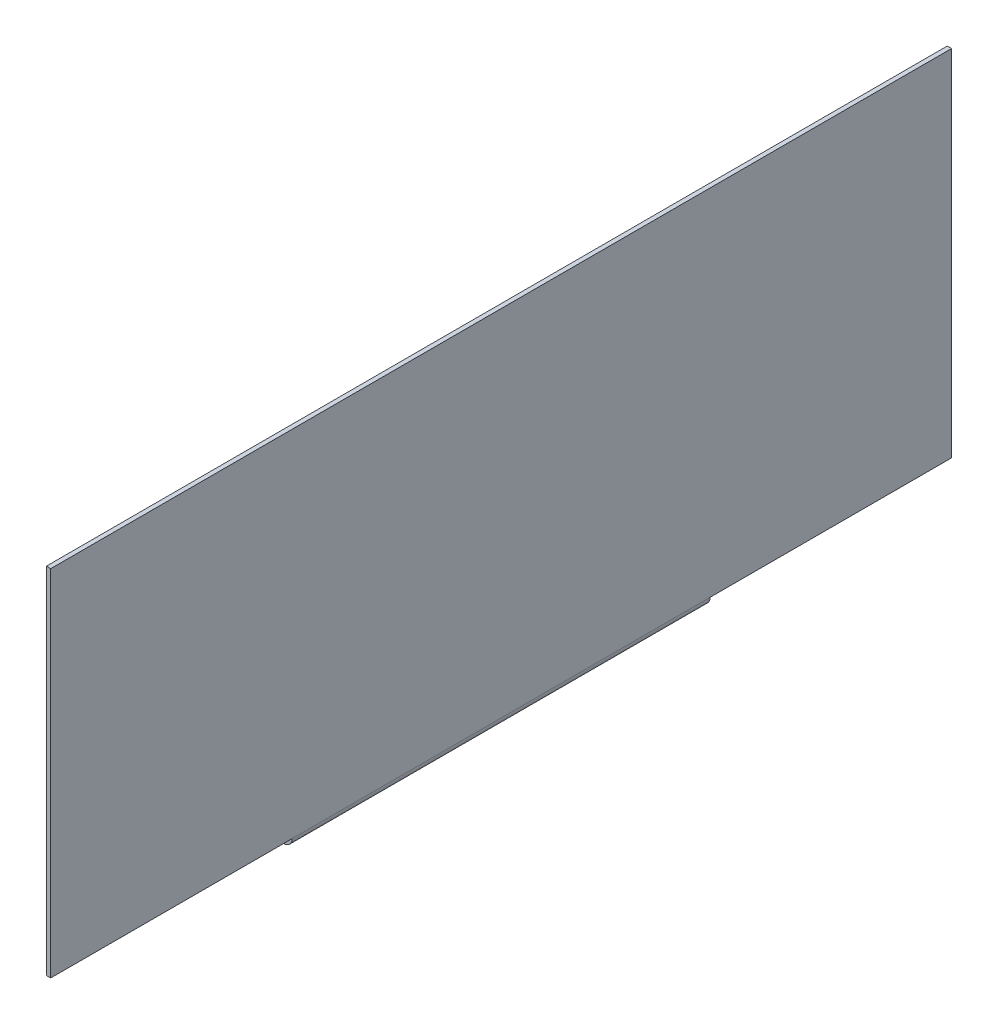
ISO-10303-21;
HEADER;
FILE_DESCRIPTION(('STEP AP214'),'2;1');
FILE_NAME('part.step','',(''),(''),'','','');
FILE_SCHEMA(('AUTOMOTIVE_DESIGN { 1 0 10303 214 1 1 1 1 }'));
ENDSEC;
DATA;
#1=APPLICATION_CONTEXT('core data for automotive mechanical design processes');
#2=APPLICATION_PROTOCOL_DEFINITION('international standard','automotive_design',2000,#1);
#3=PRODUCT_CONTEXT('',#1,'mechanical');
#4=PRODUCT('Part','Part','',(#3));
#5=PRODUCT_RELATED_PRODUCT_CATEGORY('part','',(#4));
#6=PRODUCT_DEFINITION_FORMATION('','',#4);
#7=PRODUCT_DEFINITION_CONTEXT('part definition',#1,'design');
#8=PRODUCT_DEFINITION('design','',#6,#7);
#9=PRODUCT_DEFINITION_SHAPE('','',#8);
#10=(LENGTH_UNIT() NAMED_UNIT(*) SI_UNIT(.MILLI.,.METRE.));
#11=(NAMED_UNIT(*) PLANE_ANGLE_UNIT() SI_UNIT($,.RADIAN.));
#12=(NAMED_UNIT(*) SI_UNIT($,.STERADIAN.) SOLID_ANGLE_UNIT());
#13=UNCERTAINTY_MEASURE_WITH_UNIT(LENGTH_MEASURE(1.E-05),#10,'distance_accuracy_value','');
#14=(GEOMETRIC_REPRESENTATION_CONTEXT(3) GLOBAL_UNCERTAINTY_ASSIGNED_CONTEXT((#13)) GLOBAL_UNIT_ASSIGNED_CONTEXT((#10,
#11,#12)) REPRESENTATION_CONTEXT('',''));
#15=CARTESIAN_POINT('',(0.,0.,0.));
#16=DIRECTION('',(0.,0.,1.));
#17=DIRECTION('',(1.,0.,0.));
#18=AXIS2_PLACEMENT_3D('',#15,#16,#17);
#19=CARTESIAN_POINT('',(-3.175,-130.175,330.79309));
#20=DIRECTION('',(0.,-1.,0.));
#21=DIRECTION('',(0.,0.,-1.));
#22=AXIS2_PLACEMENT_3D('',#19,#20,#21);
#23=PLANE('',#22);
#24=DIRECTION('',(0.,0.,-1.));
#25=VECTOR('',#24,1.);
#26=CARTESIAN_POINT('',(-3.175,-130.175,330.79309));
#27=LINE('',#26,#25);
#28=CARTESIAN_POINT('',(-3.175,-130.175,330.79309));
#29=VERTEX_POINT('',#28);
#30=CARTESIAN_POINT('',(-3.175,-130.175,153.43886));
#31=VERTEX_POINT('',#30);
#32=EDGE_CURVE('E215',#29,#31,#27,.T.);
#33=ORIENTED_EDGE('',*,*,#32,.T.);
#34=DIRECTION('',(1.,0.,0.));
#35=VECTOR('',#34,1.);
#36=CARTESIAN_POINT('',(-3.175,-130.175,153.43886));
#37=LINE('',#36,#35);
#38=CARTESIAN_POINT('',(0.,-130.175,153.43886));
#39=VERTEX_POINT('',#38);
#40=EDGE_CURVE('E195',#31,#39,#37,.T.);
#41=ORIENTED_EDGE('',*,*,#40,.T.);
#42=DIRECTION('',(0.,0.,-1.));
#43=VECTOR('',#42,1.);
#44=CARTESIAN_POINT('',(0.,-130.175,330.79309));
#45=LINE('',#44,#43);
#46=CARTESIAN_POINT('',(0.,-130.175,330.79309));
#47=VERTEX_POINT('',#46);
#48=EDGE_CURVE('E210',#47,#39,#45,.T.);
#49=ORIENTED_EDGE('',*,*,#48,.F.);
#50=DIRECTION('',(1.,0.,0.));
#51=VECTOR('',#50,1.);
#52=CARTESIAN_POINT('',(-3.175,-130.175,330.79309));
#53=LINE('',#52,#51);
#54=EDGE_CURVE('E67',#29,#47,#53,.T.);
#55=ORIENTED_EDGE('',*,*,#54,.F.);
#56=EDGE_LOOP('',(#33,#41,#49,#55));
#57=FACE_BOUND('',#56,.T.);
#58=ADVANCED_FACE('F58',(#57),#23,.T.);
#59=CARTESIAN_POINT('',(-3.175,130.175,-330.79309));
#60=DIRECTION('',(0.,0.,-1.));
#61=DIRECTION('',(-1.,0.,0.));
#62=AXIS2_PLACEMENT_3D('',#59,#60,#61);
#63=PLANE('',#62);
#64=DIRECTION('',(0.,1.,0.));
#65=VECTOR('',#64,1.);
#66=CARTESIAN_POINT('',(0.,130.175,-330.79309));
#67=LINE('',#66,#65);
#68=CARTESIAN_POINT('',(0.,-130.175,-330.79309));
#69=VERTEX_POINT('',#68);
#70=CARTESIAN_POINT('',(0.,130.175,-330.79309));
#71=VERTEX_POINT('',#70);
#72=EDGE_CURVE('E204',#69,#71,#67,.T.);
#73=ORIENTED_EDGE('',*,*,#72,.F.);
#74=DIRECTION('',(1.,0.,0.));
#75=VECTOR('',#74,1.);
#76=CARTESIAN_POINT('',(-3.175,-130.175,-330.79309));
#77=LINE('',#76,#75);
#78=CARTESIAN_POINT('',(-3.175,-130.175,-330.79309));
#79=VERTEX_POINT('',#78);
#80=EDGE_CURVE('E13',#79,#69,#77,.T.);
#81=ORIENTED_EDGE('',*,*,#80,.F.);
#82=DIRECTION('',(0.,1.,0.));
#83=VECTOR('',#82,1.);
#84=CARTESIAN_POINT('',(-3.175,130.175,-330.79309));
#85=LINE('',#84,#83);
#86=CARTESIAN_POINT('',(-3.175,130.175,-330.79309));
#87=VERTEX_POINT('',#86);
#88=EDGE_CURVE('E206',#79,#87,#85,.T.);
#89=ORIENTED_EDGE('',*,*,#88,.T.);
#90=DIRECTION('',(1.,0.,0.));
#91=VECTOR('',#90,1.);
#92=CARTESIAN_POINT('',(-3.175,130.175,-330.79309));
#93=LINE('',#92,#91);
#94=EDGE_CURVE('E62',#87,#71,#93,.T.);
#95=ORIENTED_EDGE('',*,*,#94,.T.);
#96=EDGE_LOOP('',(#73,#81,#89,#95));
#97=FACE_BOUND('',#96,.T.);
#98=ADVANCED_FACE('F60',(#97),#63,.T.);
#99=DIRECTION('',(1.,0.,0.));
#100=VECTOR('',#99,1.);
#101=CARTESIAN_POINT('',(-3.175,-130.175,-153.43886));
#102=LINE('',#101,#100);
#103=CARTESIAN_POINT('',(-3.175,-130.175,-153.43886));
#104=VERTEX_POINT('',#103);
#105=CARTESIAN_POINT('',(0.,-130.175,-153.43886));
#106=VERTEX_POINT('',#105);
#107=EDGE_CURVE('E202',#104,#106,#102,.T.);
#108=ORIENTED_EDGE('',*,*,#107,.F.);
#109=EDGE_CURVE('E83',#104,#79,#27,.T.);
#110=ORIENTED_EDGE('',*,*,#109,.T.);
#111=ORIENTED_EDGE('',*,*,#80,.T.);
#112=EDGE_CURVE('E106',#106,#69,#45,.T.);
#113=ORIENTED_EDGE('',*,*,#112,.F.);
#114=EDGE_LOOP('',(#108,#110,#111,#113));
#115=FACE_BOUND('',#114,.T.);
#116=ADVANCED_FACE('F249',(#115),#23,.T.);
#117=CARTESIAN_POINT('',(-3.175,130.175,330.79309));
#118=DIRECTION('',(0.,0.,1.));
#119=DIRECTION('',(1.,0.,0.));
#120=AXIS2_PLACEMENT_3D('',#117,#118,#119);
#121=PLANE('',#120);
#122=DIRECTION('',(0.,-1.,0.));
#123=VECTOR('',#122,1.);
#124=CARTESIAN_POINT('',(0.,130.175,330.79309));
#125=LINE('',#124,#123);
#126=CARTESIAN_POINT('',(0.,130.175,330.79309));
#127=VERTEX_POINT('',#126);
#128=EDGE_CURVE('E222',#127,#47,#125,.T.);
#129=ORIENTED_EDGE('',*,*,#128,.F.);
#130=DIRECTION('',(1.,0.,0.));
#131=VECTOR('',#130,1.);
#132=CARTESIAN_POINT('',(-3.175,130.175,330.79309));
#133=LINE('',#132,#131);
#134=CARTESIAN_POINT('',(-3.175,130.175,330.79309));
#135=VERTEX_POINT('',#134);
#136=EDGE_CURVE('E227',#135,#127,#133,.T.);
#137=ORIENTED_EDGE('',*,*,#136,.F.);
#138=DIRECTION('',(0.,-1.,0.));
#139=VECTOR('',#138,1.);
#140=CARTESIAN_POINT('',(-3.175,130.175,330.79309));
#141=LINE('',#140,#139);
#142=EDGE_CURVE('E212',#135,#29,#141,.T.);
#143=ORIENTED_EDGE('',*,*,#142,.T.);
#144=ORIENTED_EDGE('',*,*,#54,.T.);
#145=EDGE_LOOP('',(#129,#137,#143,#144));
#146=FACE_BOUND('',#145,.T.);
#147=ADVANCED_FACE('F255',(#146),#121,.T.);
#148=CARTESIAN_POINT('',(-3.175,130.175,330.79309));
#149=DIRECTION('',(0.,1.,0.));
#150=DIRECTION('',(0.,0.,1.));
#151=AXIS2_PLACEMENT_3D('',#148,#149,#150);
#152=PLANE('',#151);
#153=DIRECTION('',(0.,0.,1.));
#154=VECTOR('',#153,1.);
#155=CARTESIAN_POINT('',(0.,130.175,330.79309));
#156=LINE('',#155,#154);
#157=EDGE_CURVE('E219',#71,#127,#156,.T.);
#158=ORIENTED_EDGE('',*,*,#157,.F.);
#159=ORIENTED_EDGE('',*,*,#94,.F.);
#160=DIRECTION('',(0.,0.,1.));
#161=VECTOR('',#160,1.);
#162=CARTESIAN_POINT('',(-3.175,130.175,330.79309));
#163=LINE('',#162,#161);
#164=EDGE_CURVE('E209',#87,#135,#163,.T.);
#165=ORIENTED_EDGE('',*,*,#164,.T.);
#166=ORIENTED_EDGE('',*,*,#136,.T.);
#167=EDGE_LOOP('',(#158,#159,#165,#166));
#168=FACE_BOUND('',#167,.T.);
#169=ADVANCED_FACE('F232',(#168),#152,.T.);
#170=CARTESIAN_POINT('',(-3.175,0.,0.));
#171=DIRECTION('',(1.,0.,0.));
#172=DIRECTION('',(0.,0.,-1.));
#173=AXIS2_PLACEMENT_3D('',#170,#171,#172);
#174=PLANE('',#173);
#175=ORIENTED_EDGE('',*,*,#88,.F.);
#176=ORIENTED_EDGE('',*,*,#109,.F.);
#177=DIRECTION('',(0.,0.,1.));
#178=VECTOR('',#177,1.);
#179=CARTESIAN_POINT('',(-3.175,-130.175,153.43886));
#180=LINE('',#179,#178);
#181=EDGE_CURVE('E199',#31,#104,#180,.F.);
#182=ORIENTED_EDGE('',*,*,#181,.F.);
#183=ORIENTED_EDGE('',*,*,#32,.F.);
#184=ORIENTED_EDGE('',*,*,#142,.F.);
#185=ORIENTED_EDGE('',*,*,#164,.F.);
#186=EDGE_LOOP('',(#175,#176,#182,#183,#184,#185));
#187=FACE_BOUND('',#186,.T.);
#188=ADVANCED_FACE('F236',(#187),#174,.F.);
#189=CARTESIAN_POINT('',(0.,0.,0.));
#190=DIRECTION('',(1.,0.,0.));
#191=DIRECTION('',(0.,0.,-1.));
#192=AXIS2_PLACEMENT_3D('',#189,#190,#191);
#193=PLANE('',#192);
#194=ORIENTED_EDGE('',*,*,#72,.T.);
#195=ORIENTED_EDGE('',*,*,#157,.T.);
#196=ORIENTED_EDGE('',*,*,#128,.T.);
#197=ORIENTED_EDGE('',*,*,#48,.T.);
#198=DIRECTION('',(0.,0.,1.));
#199=VECTOR('',#198,1.);
#200=CARTESIAN_POINT('',(0.,-130.175,153.43886));
#201=LINE('',#200,#199);
#202=EDGE_CURVE('E150',#39,#106,#201,.F.);
#203=ORIENTED_EDGE('',*,*,#202,.T.);
#204=ORIENTED_EDGE('',*,*,#112,.T.);
#205=EDGE_LOOP('',(#194,#195,#196,#197,#203,#204));
#206=FACE_BOUND('',#205,.T.);
#207=ADVANCED_FACE('F233',(#206),#193,.T.);
#208=CARTESIAN_POINT('',(-6.35000000000001,-130.175,-153.43886));
#209=DIRECTION('',(0.,0.,-1.));
#210=DIRECTION('',(-1.,0.,0.));
#211=AXIS2_PLACEMENT_3D('',#208,#209,#210);
#212=PLANE('',#211);
#213=DIRECTION('',(0.,-1.,0.));
#214=VECTOR('',#213,1.);
#215=CARTESIAN_POINT('',(-6.34999999999998,-136.525,-153.43886));
#216=LINE('',#215,#214);
#217=CARTESIAN_POINT('',(-6.34999999999999,-133.35,-153.43886));
#218=VERTEX_POINT('',#217);
#219=CARTESIAN_POINT('',(-6.34999999999998,-136.525,-153.43886));
#220=VERTEX_POINT('',#219);
#221=EDGE_CURVE('E190',#218,#220,#216,.T.);
#222=ORIENTED_EDGE('',*,*,#221,.F.);
#223=CARTESIAN_POINT('',(-6.35000000000001,-130.175,-153.43886));
#224=DIRECTION('',(0.,0.,1.));
#225=DIRECTION('',(1.,0.,0.));
#226=AXIS2_PLACEMENT_3D('',#223,#224,#225);
#227=CIRCLE('',#226,3.17500000000001);
#228=EDGE_CURVE('E152',#104,#218,#227,.F.);
#229=ORIENTED_EDGE('',*,*,#228,.F.);
#230=ORIENTED_EDGE('',*,*,#107,.T.);
#231=CARTESIAN_POINT('',(-6.35000000000001,-130.175,-153.43886));
#232=DIRECTION('',(0.,0.,1.));
#233=DIRECTION('',(1.,0.,0.));
#234=AXIS2_PLACEMENT_3D('',#231,#232,#233);
#235=CIRCLE('',#234,6.35000000000001);
#236=EDGE_CURVE('E194',#106,#220,#235,.F.);
#237=ORIENTED_EDGE('',*,*,#236,.T.);
#238=EDGE_LOOP('',(#222,#229,#230,#237));
#239=FACE_BOUND('',#238,.T.);
#240=ADVANCED_FACE('F235',(#239),#212,.T.);
#241=CARTESIAN_POINT('',(-6.35000000000001,-130.175,153.43886));
#242=DIRECTION('',(0.,0.,-1.));
#243=DIRECTION('',(-1.,0.,0.));
#244=AXIS2_PLACEMENT_3D('',#241,#242,#243);
#245=PLANE('',#244);
#246=CARTESIAN_POINT('',(-6.35000000000001,-130.175,153.43886));
#247=DIRECTION('',(0.,0.,1.));
#248=DIRECTION('',(1.,0.,0.));
#249=AXIS2_PLACEMENT_3D('',#246,#247,#248);
#250=CIRCLE('',#249,3.17500000000001);
#251=CARTESIAN_POINT('',(-6.34999999999999,-133.35,153.43886));
#252=VERTEX_POINT('',#251);
#253=EDGE_CURVE('E159',#252,#31,#250,.T.);
#254=ORIENTED_EDGE('',*,*,#253,.F.);
#255=DIRECTION('',(0.,-1.,0.));
#256=VECTOR('',#255,1.);
#257=CARTESIAN_POINT('',(-6.34999999999999,-133.35,153.43886));
#258=LINE('',#257,#256);
#259=CARTESIAN_POINT('',(-6.34999999999998,-136.525,153.43886));
#260=VERTEX_POINT('',#259);
#261=EDGE_CURVE('E156',#252,#260,#258,.T.);
#262=ORIENTED_EDGE('',*,*,#261,.T.);
#263=CARTESIAN_POINT('',(-6.35000000000001,-130.175,153.43886));
#264=DIRECTION('',(0.,0.,1.));
#265=DIRECTION('',(1.,0.,0.));
#266=AXIS2_PLACEMENT_3D('',#263,#264,#265);
#267=CIRCLE('',#266,6.35000000000001);
#268=EDGE_CURVE('E75',#260,#39,#267,.T.);
#269=ORIENTED_EDGE('',*,*,#268,.T.);
#270=ORIENTED_EDGE('',*,*,#40,.F.);
#271=EDGE_LOOP('',(#254,#262,#269,#270));
#272=FACE_BOUND('',#271,.T.);
#273=ADVANCED_FACE('F157',(#272),#245,.F.);
#274=CARTESIAN_POINT('',(-6.35000000000001,-130.175,153.43886));
#275=DIRECTION('',(0.,0.,1.));
#276=DIRECTION('',(0.,-1.,0.));
#277=AXIS2_PLACEMENT_3D('',#274,#275,#276);
#278=CYLINDRICAL_SURFACE('',#277,6.35000000000001);
#279=ORIENTED_EDGE('',*,*,#202,.F.);
#280=ORIENTED_EDGE('',*,*,#268,.F.);
#281=DIRECTION('',(0.,0.,1.));
#282=VECTOR('',#281,1.);
#283=CARTESIAN_POINT('',(-6.34999999999998,-136.525,0.));
#284=LINE('',#283,#282);
#285=EDGE_CURVE('E148',#220,#260,#284,.T.);
#286=ORIENTED_EDGE('',*,*,#285,.F.);
#287=ORIENTED_EDGE('',*,*,#236,.F.);
#288=EDGE_LOOP('',(#279,#280,#286,#287));
#289=FACE_BOUND('',#288,.T.);
#290=ADVANCED_FACE('F145',(#289),#278,.T.);
#291=CARTESIAN_POINT('',(-6.35000000000001,-130.175,153.43886));
#292=DIRECTION('',(0.,0.,1.));
#293=DIRECTION('',(0.,-1.,0.));
#294=AXIS2_PLACEMENT_3D('',#291,#292,#293);
#295=CYLINDRICAL_SURFACE('',#294,3.17500000000001);
#296=ORIENTED_EDGE('',*,*,#181,.T.);
#297=ORIENTED_EDGE('',*,*,#228,.T.);
#298=DIRECTION('',(0.,0.,-1.));
#299=VECTOR('',#298,1.);
#300=CARTESIAN_POINT('',(-6.34999999999999,-133.35,-153.43886));
#301=LINE('',#300,#299);
#302=EDGE_CURVE('E164',#218,#252,#301,.F.);
#303=ORIENTED_EDGE('',*,*,#302,.T.);
#304=ORIENTED_EDGE('',*,*,#253,.T.);
#305=EDGE_LOOP('',(#296,#297,#303,#304));
#306=FACE_BOUND('',#305,.T.);
#307=ADVANCED_FACE('F266',(#306),#295,.F.);
#308=CARTESIAN_POINT('',(-25.4,-136.525,153.43886));
#309=DIRECTION('',(0.,0.,1.));
#310=DIRECTION('',(1.,0.,0.));
#311=AXIS2_PLACEMENT_3D('',#308,#309,#310);
#312=PLANE('',#311);
#313=DIRECTION('',(1.,0.,0.));
#314=VECTOR('',#313,1.);
#315=CARTESIAN_POINT('',(-25.4,-136.525,153.43886));
#316=LINE('',#315,#314);
#317=CARTESIAN_POINT('',(-25.4,-136.525,153.43886));
#318=VERTEX_POINT('',#317);
#319=EDGE_CURVE('E171',#318,#260,#316,.T.);
#320=ORIENTED_EDGE('',*,*,#319,.T.);
#321=ORIENTED_EDGE('',*,*,#261,.F.);
#322=DIRECTION('',(-1.,0.,0.));
#323=VECTOR('',#322,1.);
#324=CARTESIAN_POINT('',(2.9608379240439E-13,-133.35,153.43886));
#325=LINE('',#324,#323);
#326=CARTESIAN_POINT('',(-25.4,-133.35,153.43886));
#327=VERTEX_POINT('',#326);
#328=EDGE_CURVE('E174',#327,#252,#325,.F.);
#329=ORIENTED_EDGE('',*,*,#328,.F.);
#330=DIRECTION('',(0.,1.,0.));
#331=VECTOR('',#330,1.);
#332=CARTESIAN_POINT('',(-25.4,-136.525,153.43886));
#333=LINE('',#332,#331);
#334=EDGE_CURVE('E177',#318,#327,#333,.T.);
#335=ORIENTED_EDGE('',*,*,#334,.F.);
#336=EDGE_LOOP('',(#320,#321,#329,#335));
#337=FACE_BOUND('',#336,.T.);
#338=ADVANCED_FACE('F176',(#337),#312,.T.);
#339=CARTESIAN_POINT('',(-25.4,-136.525,-153.43886));
#340=DIRECTION('',(0.,0.,-1.));
#341=DIRECTION('',(-1.,0.,0.));
#342=AXIS2_PLACEMENT_3D('',#339,#340,#341);
#343=PLANE('',#342);
#344=DIRECTION('',(1.,0.,0.));
#345=VECTOR('',#344,1.);
#346=CARTESIAN_POINT('',(4.87705114388908E-13,-133.35,-153.43886));
#347=LINE('',#346,#345);
#348=CARTESIAN_POINT('',(-25.4,-133.35,-153.43886));
#349=VERTEX_POINT('',#348);
#350=EDGE_CURVE('E183',#218,#349,#347,.F.);
#351=ORIENTED_EDGE('',*,*,#350,.F.);
#352=ORIENTED_EDGE('',*,*,#221,.T.);
#353=DIRECTION('',(-1.,0.,0.));
#354=VECTOR('',#353,1.);
#355=CARTESIAN_POINT('',(-25.4,-136.525,-153.43886));
#356=LINE('',#355,#354);
#357=CARTESIAN_POINT('',(-25.4,-136.525,-153.43886));
#358=VERTEX_POINT('',#357);
#359=EDGE_CURVE('E173',#220,#358,#356,.T.);
#360=ORIENTED_EDGE('',*,*,#359,.T.);
#361=DIRECTION('',(0.,1.,0.));
#362=VECTOR('',#361,1.);
#363=CARTESIAN_POINT('',(-25.4,-136.525,-153.43886));
#364=LINE('',#363,#362);
#365=EDGE_CURVE('E275',#358,#349,#364,.T.);
#366=ORIENTED_EDGE('',*,*,#365,.T.);
#367=EDGE_LOOP('',(#351,#352,#360,#366));
#368=FACE_BOUND('',#367,.T.);
#369=ADVANCED_FACE('F273',(#368),#343,.T.);
#370=CARTESIAN_POINT('',(4.98790567639735E-13,-136.525,0.));
#371=DIRECTION('',(0.,-1.,0.));
#372=DIRECTION('',(1.,0.,0.));
#373=AXIS2_PLACEMENT_3D('',#370,#371,#372);
#374=PLANE('',#373);
#375=ORIENTED_EDGE('',*,*,#359,.F.);
#376=ORIENTED_EDGE('',*,*,#285,.T.);
#377=ORIENTED_EDGE('',*,*,#319,.F.);
#378=DIRECTION('',(0.,0.,1.));
#379=VECTOR('',#378,1.);
#380=CARTESIAN_POINT('',(-25.4,-136.525,153.43886));
#381=LINE('',#380,#379);
#382=EDGE_CURVE('E180',#358,#318,#381,.T.);
#383=ORIENTED_EDGE('',*,*,#382,.F.);
#384=EDGE_LOOP('',(#375,#376,#377,#383));
#385=FACE_BOUND('',#384,.T.);
#386=ADVANCED_FACE('F169',(#385),#374,.T.);
#387=CARTESIAN_POINT('',(4.87705114388908E-13,-133.35,0.));
#388=DIRECTION('',(0.,-1.,0.));
#389=DIRECTION('',(1.,0.,0.));
#390=AXIS2_PLACEMENT_3D('',#387,#388,#389);
#391=PLANE('',#390);
#392=ORIENTED_EDGE('',*,*,#302,.F.);
#393=ORIENTED_EDGE('',*,*,#350,.T.);
#394=DIRECTION('',(0.,0.,-1.));
#395=VECTOR('',#394,1.);
#396=CARTESIAN_POINT('',(-25.4,-133.35,0.));
#397=LINE('',#396,#395);
#398=EDGE_CURVE('E178',#349,#327,#397,.F.);
#399=ORIENTED_EDGE('',*,*,#398,.T.);
#400=ORIENTED_EDGE('',*,*,#328,.T.);
#401=EDGE_LOOP('',(#392,#393,#399,#400));
#402=FACE_BOUND('',#401,.T.);
#403=ADVANCED_FACE('F270',(#402),#391,.F.);
#404=CARTESIAN_POINT('',(-25.4,-136.525,153.43886));
#405=DIRECTION('',(-1.,0.,0.));
#406=DIRECTION('',(0.,-1.,0.));
#407=AXIS2_PLACEMENT_3D('',#404,#405,#406);
#408=PLANE('',#407);
#409=ORIENTED_EDGE('',*,*,#398,.F.);
#410=ORIENTED_EDGE('',*,*,#365,.F.);
#411=ORIENTED_EDGE('',*,*,#382,.T.);
#412=ORIENTED_EDGE('',*,*,#334,.T.);
#413=EDGE_LOOP('',(#409,#410,#411,#412));
#414=FACE_BOUND('',#413,.T.);
#415=ADVANCED_FACE('F279',(#414),#408,.T.);
#416=CLOSED_SHELL('',(#58,#98,#116,#147,#169,#188,#207,#240,#273,#290,#307,#338,#369,#386,#403,#415));
#417=MANIFOLD_SOLID_BREP('B2',#416);
#418=ADVANCED_BREP_SHAPE_REPRESENTATION('',(#18,#417),#14);
#419=SHAPE_DEFINITION_REPRESENTATION(#9,#418);
ENDSEC;
END-ISO-10303-21;
